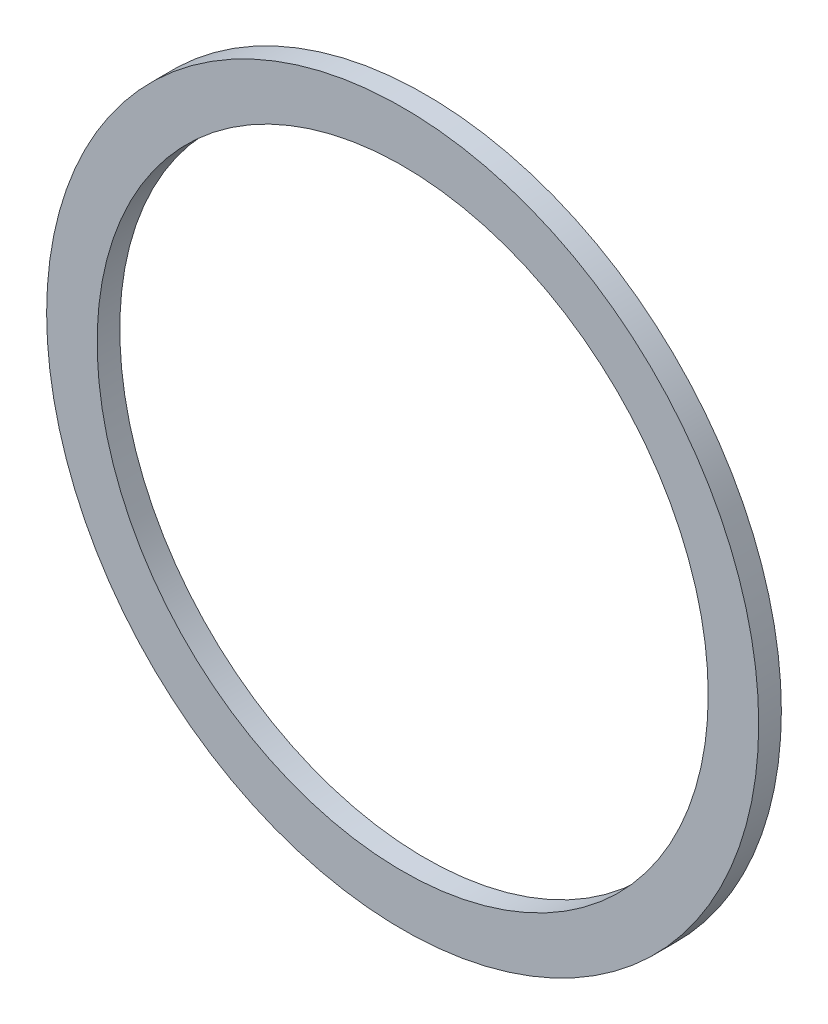
ISO-10303-21;
HEADER;
FILE_DESCRIPTION(('STEP AP214'),'2;1');
FILE_NAME('part.step','',(''),(''),'','','');
FILE_SCHEMA(('AUTOMOTIVE_DESIGN { 1 0 10303 214 1 1 1 1 }'));
ENDSEC;
DATA;
#1=APPLICATION_CONTEXT('core data for automotive mechanical design processes');
#2=APPLICATION_PROTOCOL_DEFINITION('international standard','automotive_design',2000,#1);
#3=PRODUCT_CONTEXT('',#1,'mechanical');
#4=PRODUCT('Part','Part','',(#3));
#5=PRODUCT_RELATED_PRODUCT_CATEGORY('part','',(#4));
#6=PRODUCT_DEFINITION_FORMATION('','',#4);
#7=PRODUCT_DEFINITION_CONTEXT('part definition',#1,'design');
#8=PRODUCT_DEFINITION('design','',#6,#7);
#9=PRODUCT_DEFINITION_SHAPE('','',#8);
#10=(LENGTH_UNIT() NAMED_UNIT(*) SI_UNIT(.MILLI.,.METRE.));
#11=(NAMED_UNIT(*) PLANE_ANGLE_UNIT() SI_UNIT($,.RADIAN.));
#12=(NAMED_UNIT(*) SI_UNIT($,.STERADIAN.) SOLID_ANGLE_UNIT());
#13=UNCERTAINTY_MEASURE_WITH_UNIT(LENGTH_MEASURE(1.E-05),#10,'distance_accuracy_value','');
#14=(GEOMETRIC_REPRESENTATION_CONTEXT(3) GLOBAL_UNCERTAINTY_ASSIGNED_CONTEXT((#13)) GLOBAL_UNIT_ASSIGNED_CONTEXT((#10,
#11,#12)) REPRESENTATION_CONTEXT('',''));
#15=CARTESIAN_POINT('',(0.,0.,0.));
#16=DIRECTION('',(0.,0.,1.));
#17=DIRECTION('',(1.,0.,0.));
#18=AXIS2_PLACEMENT_3D('',#15,#16,#17);
#19=CARTESIAN_POINT('',(0.,0.,0.));
#20=DIRECTION('',(0.,0.,1.));
#21=DIRECTION('',(1.,0.,0.));
#22=AXIS2_PLACEMENT_3D('',#19,#20,#21);
#23=CYLINDRICAL_SURFACE('',#22,23.6);
#24=DIRECTION('',(0.,0.,1.));
#25=VECTOR('',#24,1.);
#26=CARTESIAN_POINT('',(23.6,0.,0.));
#27=LINE('',#26,#25);
#28=CARTESIAN_POINT('',(23.6,0.,0.));
#29=VERTEX_POINT('',#28);
#30=CARTESIAN_POINT('',(23.6,0.,1.75));
#31=VERTEX_POINT('',#30);
#32=EDGE_CURVE('E9',#29,#31,#27,.T.);
#33=ORIENTED_EDGE('',*,*,#32,.F.);
#34=CARTESIAN_POINT('',(0.,0.,0.));
#35=DIRECTION('',(0.,0.,1.));
#36=DIRECTION('',(1.,0.,0.));
#37=AXIS2_PLACEMENT_3D('',#34,#35,#36);
#38=CIRCLE('',#37,23.6);
#39=EDGE_CURVE('E23',#29,#29,#38,.T.);
#40=ORIENTED_EDGE('',*,*,#39,.F.);
#41=ORIENTED_EDGE('',*,*,#32,.T.);
#42=CARTESIAN_POINT('',(0.,0.,1.75));
#43=DIRECTION('',(0.,0.,1.));
#44=DIRECTION('',(1.,0.,0.));
#45=AXIS2_PLACEMENT_3D('',#42,#43,#44);
#46=CIRCLE('',#45,23.6);
#47=EDGE_CURVE('E65',#31,#31,#46,.T.);
#48=ORIENTED_EDGE('',*,*,#47,.T.);
#49=EDGE_LOOP('',(#33,#40,#41,#48));
#50=FACE_BOUND('',#49,.T.);
#51=ADVANCED_FACE('F15',(#50),#23,.F.);
#52=CARTESIAN_POINT('',(0.,0.,0.));
#53=DIRECTION('',(0.,0.,1.));
#54=DIRECTION('',(1.,0.,0.));
#55=AXIS2_PLACEMENT_3D('',#52,#53,#54);
#56=PLANE('',#55);
#57=ORIENTED_EDGE('',*,*,#39,.T.);
#58=EDGE_LOOP('',(#57));
#59=FACE_BOUND('',#58,.T.);
#60=CARTESIAN_POINT('',(0.,0.,0.));
#61=DIRECTION('',(0.,0.,1.));
#62=DIRECTION('',(1.,0.,0.));
#63=AXIS2_PLACEMENT_3D('',#60,#61,#62);
#64=CIRCLE('',#63,27.5);
#65=CARTESIAN_POINT('',(27.5,0.,0.));
#66=VERTEX_POINT('',#65);
#67=EDGE_CURVE('E53',#66,#66,#64,.T.);
#68=ORIENTED_EDGE('',*,*,#67,.F.);
#69=EDGE_LOOP('',(#68));
#70=FACE_BOUND('',#69,.T.);
#71=ADVANCED_FACE('F68',(#59,#70),#56,.F.);
#72=CARTESIAN_POINT('',(0.,0.,1.75));
#73=DIRECTION('',(0.,0.,1.));
#74=DIRECTION('',(1.,0.,0.));
#75=AXIS2_PLACEMENT_3D('',#72,#73,#74);
#76=PLANE('',#75);
#77=ORIENTED_EDGE('',*,*,#47,.F.);
#78=EDGE_LOOP('',(#77));
#79=FACE_BOUND('',#78,.T.);
#80=CARTESIAN_POINT('',(0.,0.,1.75));
#81=DIRECTION('',(0.,0.,1.));
#82=DIRECTION('',(1.,0.,0.));
#83=AXIS2_PLACEMENT_3D('',#80,#81,#82);
#84=CIRCLE('',#83,27.5);
#85=CARTESIAN_POINT('',(27.5,0.,1.75));
#86=VERTEX_POINT('',#85);
#87=EDGE_CURVE('E55',#86,#86,#84,.T.);
#88=ORIENTED_EDGE('',*,*,#87,.T.);
#89=EDGE_LOOP('',(#88));
#90=FACE_BOUND('',#89,.T.);
#91=ADVANCED_FACE('F59',(#79,#90),#76,.T.);
#92=CARTESIAN_POINT('',(0.,0.,0.));
#93=DIRECTION('',(0.,0.,1.));
#94=DIRECTION('',(1.,0.,0.));
#95=AXIS2_PLACEMENT_3D('',#92,#93,#94);
#96=CYLINDRICAL_SURFACE('',#95,27.5);
#97=ORIENTED_EDGE('',*,*,#87,.F.);
#98=DIRECTION('',(0.,0.,1.));
#99=VECTOR('',#98,1.);
#100=CARTESIAN_POINT('',(27.5,0.,0.));
#101=LINE('',#100,#99);
#102=EDGE_CURVE('E47',#66,#86,#101,.T.);
#103=ORIENTED_EDGE('',*,*,#102,.F.);
#104=ORIENTED_EDGE('',*,*,#67,.T.);
#105=ORIENTED_EDGE('',*,*,#102,.T.);
#106=EDGE_LOOP('',(#97,#103,#104,#105));
#107=FACE_BOUND('',#106,.T.);
#108=ADVANCED_FACE('F51',(#107),#96,.T.);
#109=CLOSED_SHELL('',(#51,#71,#91,#108));
#110=MANIFOLD_SOLID_BREP('B1',#109);
#111=ADVANCED_BREP_SHAPE_REPRESENTATION('',(#18,#110),#14);
#112=SHAPE_DEFINITION_REPRESENTATION(#9,#111);
ENDSEC;
END-ISO-10303-21;
